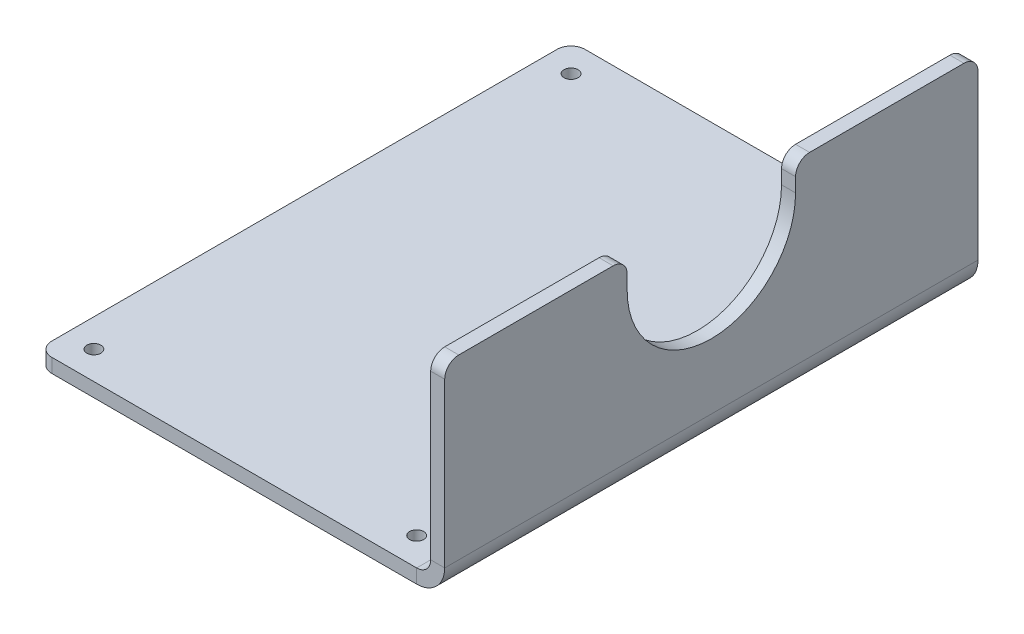
ISO-10303-21;
HEADER;
FILE_DESCRIPTION(('STEP AP214'),'2;1');
FILE_NAME('part.step','',(''),(''),'','','');
FILE_SCHEMA(('AUTOMOTIVE_DESIGN { 1 0 10303 214 1 1 1 1 }'));
ENDSEC;
DATA;
#1=APPLICATION_CONTEXT('core data for automotive mechanical design processes');
#2=APPLICATION_PROTOCOL_DEFINITION('international standard','automotive_design',2000,#1);
#3=PRODUCT_CONTEXT('',#1,'mechanical');
#4=PRODUCT('Part','Part','',(#3));
#5=PRODUCT_RELATED_PRODUCT_CATEGORY('part','',(#4));
#6=PRODUCT_DEFINITION_FORMATION('','',#4);
#7=PRODUCT_DEFINITION_CONTEXT('part definition',#1,'design');
#8=PRODUCT_DEFINITION('design','',#6,#7);
#9=PRODUCT_DEFINITION_SHAPE('','',#8);
#10=(LENGTH_UNIT() NAMED_UNIT(*) SI_UNIT(.MILLI.,.METRE.));
#11=(NAMED_UNIT(*) PLANE_ANGLE_UNIT() SI_UNIT($,.RADIAN.));
#12=(NAMED_UNIT(*) SI_UNIT($,.STERADIAN.) SOLID_ANGLE_UNIT());
#13=UNCERTAINTY_MEASURE_WITH_UNIT(LENGTH_MEASURE(1.E-05),#10,'distance_accuracy_value','');
#14=(GEOMETRIC_REPRESENTATION_CONTEXT(3) GLOBAL_UNCERTAINTY_ASSIGNED_CONTEXT((#13)) GLOBAL_UNIT_ASSIGNED_CONTEXT((#10,
#11,#12)) REPRESENTATION_CONTEXT('',''));
#15=CARTESIAN_POINT('',(0.,0.,0.));
#16=DIRECTION('',(0.,0.,1.));
#17=DIRECTION('',(1.,0.,0.));
#18=AXIS2_PLACEMENT_3D('',#15,#16,#17);
#19=CARTESIAN_POINT('',(88.9000000000003,-86.8559175063607,0.));
#20=DIRECTION('',(1.,0.,0.));
#21=DIRECTION('',(0.,0.,-1.));
#22=AXIS2_PLACEMENT_3D('',#19,#20,#21);
#23=PLANE('',#22);
#24=DIRECTION('',(0.,1.,0.));
#25=VECTOR('',#24,1.);
#26=CARTESIAN_POINT('',(88.9,4.84884832523127E-13,-79.3750000000001));
#27=LINE('',#26,#25);
#28=CARTESIAN_POINT('',(88.8999999999999,40.1440824936393,-79.375));
#29=VERTEX_POINT('',#28);
#30=CARTESIAN_POINT('',(88.8999999999999,43.3190824936393,-79.375));
#31=VERTEX_POINT('',#30);
#32=EDGE_CURVE('E218',#29,#31,#27,.T.);
#33=ORIENTED_EDGE('',*,*,#32,.T.);
#34=CARTESIAN_POINT('',(88.8999999999999,43.3190824936393,-82.55));
#35=DIRECTION('',(1.,0.,0.));
#36=DIRECTION('',(0.,1.,0.));
#37=AXIS2_PLACEMENT_3D('',#34,#35,#36);
#38=CIRCLE('',#37,3.175);
#39=CARTESIAN_POINT('',(88.8999999999999,46.4940824936393,-82.55));
#40=VERTEX_POINT('',#39);
#41=EDGE_CURVE('E307',#31,#40,#38,.F.);
#42=ORIENTED_EDGE('',*,*,#41,.T.);
#43=DIRECTION('',(0.,0.,-1.));
#44=VECTOR('',#43,1.);
#45=CARTESIAN_POINT('',(88.8999999999999,46.4940824936393,0.));
#46=LINE('',#45,#44);
#47=CARTESIAN_POINT('',(88.8999999999999,46.4940824936393,-117.475));
#48=VERTEX_POINT('',#47);
#49=EDGE_CURVE('E274',#40,#48,#46,.T.);
#50=ORIENTED_EDGE('',*,*,#49,.T.);
#51=CARTESIAN_POINT('',(88.8999999999999,43.3190824936393,-117.475));
#52=DIRECTION('',(1.,0.,0.));
#53=DIRECTION('',(0.,1.,0.));
#54=AXIS2_PLACEMENT_3D('',#51,#52,#53);
#55=CIRCLE('',#54,3.175);
#56=CARTESIAN_POINT('',(88.8999999999999,43.3190824936393,-120.65));
#57=VERTEX_POINT('',#56);
#58=EDGE_CURVE('E305',#48,#57,#55,.F.);
#59=ORIENTED_EDGE('',*,*,#58,.T.);
#60=DIRECTION('',(0.,-1.,0.));
#61=VECTOR('',#60,1.);
#62=CARTESIAN_POINT('',(88.9000000000003,-86.8559175063607,-120.65));
#63=LINE('',#62,#61);
#64=CARTESIAN_POINT('',(88.9,6.35000000000001,-120.65));
#65=VERTEX_POINT('',#64);
#66=EDGE_CURVE('E273',#57,#65,#63,.T.);
#67=ORIENTED_EDGE('',*,*,#66,.T.);
#68=DIRECTION('',(0.,0.,1.));
#69=VECTOR('',#68,1.);
#70=CARTESIAN_POINT('',(88.9,6.35000000000001,0.));
#71=LINE('',#70,#69);
#72=CARTESIAN_POINT('',(88.9,6.35000000000001,0.));
#73=VERTEX_POINT('',#72);
#74=EDGE_CURVE('E280',#65,#73,#71,.T.);
#75=ORIENTED_EDGE('',*,*,#74,.T.);
#76=DIRECTION('',(0.,1.,0.));
#77=VECTOR('',#76,1.);
#78=CARTESIAN_POINT('',(88.9000000000003,-86.8559175063607,0.));
#79=LINE('',#78,#77);
#80=CARTESIAN_POINT('',(88.8999999999999,43.3190824936393,0.));
#81=VERTEX_POINT('',#80);
#82=EDGE_CURVE('E295',#73,#81,#79,.T.);
#83=ORIENTED_EDGE('',*,*,#82,.T.);
#84=CARTESIAN_POINT('',(88.8999999999999,43.3190824936393,-3.175));
#85=DIRECTION('',(1.,0.,0.));
#86=DIRECTION('',(0.,1.,0.));
#87=AXIS2_PLACEMENT_3D('',#84,#85,#86);
#88=CIRCLE('',#87,3.175);
#89=CARTESIAN_POINT('',(88.8999999999999,46.4940824936393,-3.175));
#90=VERTEX_POINT('',#89);
#91=EDGE_CURVE('E303',#81,#90,#88,.F.);
#92=ORIENTED_EDGE('',*,*,#91,.T.);
#93=CARTESIAN_POINT('',(88.8999999999999,46.4940824936393,-38.1));
#94=VERTEX_POINT('',#93);
#95=EDGE_CURVE('E270',#90,#94,#46,.T.);
#96=ORIENTED_EDGE('',*,*,#95,.T.);
#97=CARTESIAN_POINT('',(88.8999999999999,43.3190824936393,-38.1));
#98=DIRECTION('',(1.,0.,0.));
#99=DIRECTION('',(0.,1.,0.));
#100=AXIS2_PLACEMENT_3D('',#97,#98,#99);
#101=CIRCLE('',#100,3.175);
#102=CARTESIAN_POINT('',(88.8999999999999,43.3190824936393,-41.275));
#103=VERTEX_POINT('',#102);
#104=EDGE_CURVE('E301',#94,#103,#101,.F.);
#105=ORIENTED_EDGE('',*,*,#104,.T.);
#106=DIRECTION('',(0.,-1.,0.));
#107=VECTOR('',#106,1.);
#108=CARTESIAN_POINT('',(88.9,3.56515295300843E-13,-41.275));
#109=LINE('',#108,#107);
#110=CARTESIAN_POINT('',(88.8999999999999,40.1440824936393,-41.275));
#111=VERTEX_POINT('',#110);
#112=EDGE_CURVE('E221',#103,#111,#109,.T.);
#113=ORIENTED_EDGE('',*,*,#112,.T.);
#114=CARTESIAN_POINT('',(88.8999999999999,40.1440824936393,-60.325));
#115=DIRECTION('',(-1.,0.,0.));
#116=DIRECTION('',(0.,-1.,0.));
#117=AXIS2_PLACEMENT_3D('',#114,#115,#116);
#118=CIRCLE('',#117,19.05);
#119=EDGE_CURVE('E211',#111,#29,#118,.F.);
#120=ORIENTED_EDGE('',*,*,#119,.T.);
#121=EDGE_LOOP('',(#33,#42,#50,#59,#67,#75,#83,#92,#96,#105,#113,#120));
#122=FACE_BOUND('',#121,.T.);
#123=ADVANCED_FACE('F64',(#122),#23,.F.);
#124=CARTESIAN_POINT('',(88.8999999999999,46.4940824936393,0.));
#125=DIRECTION('',(0.,-1.,0.));
#126=DIRECTION('',(0.,0.,-1.));
#127=AXIS2_PLACEMENT_3D('',#124,#125,#126);
#128=PLANE('',#127);
#129=ORIENTED_EDGE('',*,*,#49,.F.);
#130=DIRECTION('',(-1.,0.,0.));
#131=VECTOR('',#130,1.);
#132=CARTESIAN_POINT('',(88.8999999999999,46.4940824936393,-82.55));
#133=LINE('',#132,#131);
#134=CARTESIAN_POINT('',(92.0749999999999,46.4940824936393,-82.55));
#135=VERTEX_POINT('',#134);
#136=EDGE_CURVE('E312',#40,#135,#133,.F.);
#137=ORIENTED_EDGE('',*,*,#136,.T.);
#138=DIRECTION('',(0.,0.,-1.));
#139=VECTOR('',#138,1.);
#140=CARTESIAN_POINT('',(92.0749999999999,46.4940824936393,0.));
#141=LINE('',#140,#139);
#142=CARTESIAN_POINT('',(92.0749999999999,46.4940824936393,-117.475));
#143=VERTEX_POINT('',#142);
#144=EDGE_CURVE('E279',#135,#143,#141,.T.);
#145=ORIENTED_EDGE('',*,*,#144,.T.);
#146=DIRECTION('',(1.,0.,0.));
#147=VECTOR('',#146,1.);
#148=CARTESIAN_POINT('',(88.8999999999999,46.4940824936393,-117.475));
#149=LINE('',#148,#147);
#150=EDGE_CURVE('E309',#143,#48,#149,.F.);
#151=ORIENTED_EDGE('',*,*,#150,.T.);
#152=EDGE_LOOP('',(#129,#137,#145,#151));
#153=FACE_BOUND('',#152,.T.);
#154=ADVANCED_FACE('F385',(#153),#128,.F.);
#155=ORIENTED_EDGE('',*,*,#95,.F.);
#156=DIRECTION('',(1.,0.,0.));
#157=VECTOR('',#156,1.);
#158=CARTESIAN_POINT('',(88.8999999999999,46.4940824936393,-3.175));
#159=LINE('',#158,#157);
#160=CARTESIAN_POINT('',(92.0749999999999,46.4940824936393,-3.175));
#161=VERTEX_POINT('',#160);
#162=EDGE_CURVE('E330',#90,#161,#159,.T.);
#163=ORIENTED_EDGE('',*,*,#162,.T.);
#164=CARTESIAN_POINT('',(92.0749999999999,46.4940824936393,-38.1));
#165=VERTEX_POINT('',#164);
#166=EDGE_CURVE('E275',#161,#165,#141,.T.);
#167=ORIENTED_EDGE('',*,*,#166,.T.);
#168=DIRECTION('',(-1.,0.,0.));
#169=VECTOR('',#168,1.);
#170=CARTESIAN_POINT('',(88.8999999999999,46.4940824936393,-38.1));
#171=LINE('',#170,#169);
#172=EDGE_CURVE('E327',#165,#94,#171,.T.);
#173=ORIENTED_EDGE('',*,*,#172,.T.);
#174=EDGE_LOOP('',(#155,#163,#167,#173));
#175=FACE_BOUND('',#174,.T.);
#176=ADVANCED_FACE('F392',(#175),#128,.F.);
#177=CARTESIAN_POINT('',(92.0750000000003,-86.8559175063607,0.));
#178=DIRECTION('',(1.,0.,0.));
#179=DIRECTION('',(0.,0.,-1.));
#180=AXIS2_PLACEMENT_3D('',#177,#178,#179);
#181=PLANE('',#180);
#182=ORIENTED_EDGE('',*,*,#144,.F.);
#183=CARTESIAN_POINT('',(92.0749999999999,43.3190824936393,-82.55));
#184=DIRECTION('',(1.,0.,0.));
#185=DIRECTION('',(0.,1.,0.));
#186=AXIS2_PLACEMENT_3D('',#183,#184,#185);
#187=CIRCLE('',#186,3.175);
#188=CARTESIAN_POINT('',(92.075,43.3190824936393,-79.375));
#189=VERTEX_POINT('',#188);
#190=EDGE_CURVE('E320',#135,#189,#187,.T.);
#191=ORIENTED_EDGE('',*,*,#190,.T.);
#192=DIRECTION('',(0.,1.,0.));
#193=VECTOR('',#192,1.);
#194=CARTESIAN_POINT('',(92.0750000000002,4.95970285773954E-13,-79.3750000000001));
#195=LINE('',#194,#193);
#196=CARTESIAN_POINT('',(92.075,40.1440824936393,-79.375));
#197=VERTEX_POINT('',#196);
#198=EDGE_CURVE('E203',#197,#189,#195,.T.);
#199=ORIENTED_EDGE('',*,*,#198,.F.);
#200=CARTESIAN_POINT('',(92.075,40.1440824936393,-60.325));
#201=DIRECTION('',(-1.,0.,0.));
#202=DIRECTION('',(0.,-1.,0.));
#203=AXIS2_PLACEMENT_3D('',#200,#201,#202);
#204=CIRCLE('',#203,19.05);
#205=CARTESIAN_POINT('',(92.075,40.1440824936393,-41.275));
#206=VERTEX_POINT('',#205);
#207=EDGE_CURVE('E204',#206,#197,#204,.F.);
#208=ORIENTED_EDGE('',*,*,#207,.F.);
#209=DIRECTION('',(0.,-1.,0.));
#210=VECTOR('',#209,1.);
#211=CARTESIAN_POINT('',(92.0750000000002,3.6760074855167E-13,-41.275));
#212=LINE('',#211,#210);
#213=CARTESIAN_POINT('',(92.075,43.3190824936393,-41.275));
#214=VERTEX_POINT('',#213);
#215=EDGE_CURVE('E192',#214,#206,#212,.T.);
#216=ORIENTED_EDGE('',*,*,#215,.F.);
#217=CARTESIAN_POINT('',(92.0749999999999,43.3190824936393,-38.1));
#218=DIRECTION('',(1.,0.,0.));
#219=DIRECTION('',(0.,1.,0.));
#220=AXIS2_PLACEMENT_3D('',#217,#218,#219);
#221=CIRCLE('',#220,3.175);
#222=EDGE_CURVE('E314',#214,#165,#221,.T.);
#223=ORIENTED_EDGE('',*,*,#222,.T.);
#224=ORIENTED_EDGE('',*,*,#166,.F.);
#225=CARTESIAN_POINT('',(92.0749999999999,43.3190824936393,-3.175));
#226=DIRECTION('',(1.,0.,0.));
#227=DIRECTION('',(0.,1.,0.));
#228=AXIS2_PLACEMENT_3D('',#225,#226,#227);
#229=CIRCLE('',#228,3.175);
#230=CARTESIAN_POINT('',(92.0749999999999,43.3190824936393,0.));
#231=VERTEX_POINT('',#230);
#232=EDGE_CURVE('E316',#161,#231,#229,.T.);
#233=ORIENTED_EDGE('',*,*,#232,.T.);
#234=DIRECTION('',(0.,1.,0.));
#235=VECTOR('',#234,1.);
#236=CARTESIAN_POINT('',(92.0750000000003,-86.8559175063607,0.));
#237=LINE('',#236,#235);
#238=CARTESIAN_POINT('',(92.075,6.35000000000002,0.));
#239=VERTEX_POINT('',#238);
#240=EDGE_CURVE('E246',#239,#231,#237,.T.);
#241=ORIENTED_EDGE('',*,*,#240,.F.);
#242=DIRECTION('',(0.,0.,1.));
#243=VECTOR('',#242,1.);
#244=CARTESIAN_POINT('',(92.075,6.35000000000002,0.));
#245=LINE('',#244,#243);
#246=CARTESIAN_POINT('',(92.075,6.35000000000002,-120.65));
#247=VERTEX_POINT('',#246);
#248=EDGE_CURVE('E286',#247,#239,#245,.T.);
#249=ORIENTED_EDGE('',*,*,#248,.F.);
#250=DIRECTION('',(0.,1.,0.));
#251=VECTOR('',#250,1.);
#252=CARTESIAN_POINT('',(92.0750000000003,-86.8559175063607,-120.65));
#253=LINE('',#252,#251);
#254=CARTESIAN_POINT('',(92.0749999999999,43.3190824936393,-120.65));
#255=VERTEX_POINT('',#254);
#256=EDGE_CURVE('E278',#255,#247,#253,.F.);
#257=ORIENTED_EDGE('',*,*,#256,.F.);
#258=CARTESIAN_POINT('',(92.0749999999999,43.3190824936393,-117.475));
#259=DIRECTION('',(1.,0.,0.));
#260=DIRECTION('',(0.,1.,0.));
#261=AXIS2_PLACEMENT_3D('',#258,#259,#260);
#262=CIRCLE('',#261,3.175);
#263=EDGE_CURVE('E318',#255,#143,#262,.T.);
#264=ORIENTED_EDGE('',*,*,#263,.T.);
#265=EDGE_LOOP('',(#182,#191,#199,#208,#216,#223,#224,#233,#241,#249,#257,#264));
#266=FACE_BOUND('',#265,.T.);
#267=ADVANCED_FACE('F216',(#266),#181,.T.);
#268=CARTESIAN_POINT('',(88.9000000000003,-86.8559175063607,-120.65));
#269=DIRECTION('',(0.,0.,1.));
#270=DIRECTION('',(0.,-1.,0.));
#271=AXIS2_PLACEMENT_3D('',#268,#269,#270);
#272=PLANE('',#271);
#273=ORIENTED_EDGE('',*,*,#66,.F.);
#274=DIRECTION('',(1.,0.,0.));
#275=VECTOR('',#274,1.);
#276=CARTESIAN_POINT('',(88.8999999999999,43.3190824936393,-120.65));
#277=LINE('',#276,#275);
#278=EDGE_CURVE('E322',#57,#255,#277,.T.);
#279=ORIENTED_EDGE('',*,*,#278,.T.);
#280=ORIENTED_EDGE('',*,*,#256,.T.);
#281=DIRECTION('',(1.,0.,0.));
#282=VECTOR('',#281,1.);
#283=CARTESIAN_POINT('',(88.9,6.35000000000001,-120.65));
#284=LINE('',#283,#282);
#285=EDGE_CURVE('E283',#65,#247,#284,.T.);
#286=ORIENTED_EDGE('',*,*,#285,.F.);
#287=EDGE_LOOP('',(#273,#279,#280,#286));
#288=FACE_BOUND('',#287,.T.);
#289=ADVANCED_FACE('F397',(#288),#272,.F.);
#290=CARTESIAN_POINT('',(88.9000000000003,-86.8559175063607,0.));
#291=DIRECTION('',(0.,0.,-1.));
#292=DIRECTION('',(0.,1.,0.));
#293=AXIS2_PLACEMENT_3D('',#290,#291,#292);
#294=PLANE('',#293);
#295=ORIENTED_EDGE('',*,*,#240,.T.);
#296=DIRECTION('',(1.,0.,0.));
#297=VECTOR('',#296,1.);
#298=CARTESIAN_POINT('',(88.8999999999999,43.3190824936393,0.));
#299=LINE('',#298,#297);
#300=EDGE_CURVE('E324',#231,#81,#299,.F.);
#301=ORIENTED_EDGE('',*,*,#300,.T.);
#302=ORIENTED_EDGE('',*,*,#82,.F.);
#303=DIRECTION('',(-1.,0.,0.));
#304=VECTOR('',#303,1.);
#305=CARTESIAN_POINT('',(88.9,6.35000000000001,0.));
#306=LINE('',#305,#304);
#307=EDGE_CURVE('E288',#239,#73,#306,.T.);
#308=ORIENTED_EDGE('',*,*,#307,.F.);
#309=EDGE_LOOP('',(#295,#301,#302,#308));
#310=FACE_BOUND('',#309,.T.);
#311=ADVANCED_FACE('F400',(#310),#294,.F.);
#312=CARTESIAN_POINT('',(0.,3.175,0.));
#313=DIRECTION('',(1.,0.,0.));
#314=DIRECTION('',(0.,0.,1.));
#315=AXIS2_PLACEMENT_3D('',#312,#313,#314);
#316=PLANE('',#315);
#317=DIRECTION('',(0.,0.,-1.));
#318=VECTOR('',#317,1.);
#319=CARTESIAN_POINT('',(0.,0.,0.));
#320=LINE('',#319,#318);
#321=CARTESIAN_POINT('',(0.,0.,-117.475));
#322=VERTEX_POINT('',#321);
#323=CARTESIAN_POINT('',(0.,0.,-3.175));
#324=VERTEX_POINT('',#323);
#325=EDGE_CURVE('E265',#322,#324,#320,.F.);
#326=ORIENTED_EDGE('',*,*,#325,.T.);
#327=DIRECTION('',(0.,-1.,0.));
#328=VECTOR('',#327,1.);
#329=CARTESIAN_POINT('',(0.,3.175,-3.175));
#330=LINE('',#329,#328);
#331=CARTESIAN_POINT('',(0.,3.175,-3.175));
#332=VERTEX_POINT('',#331);
#333=EDGE_CURVE('E335',#324,#332,#330,.F.);
#334=ORIENTED_EDGE('',*,*,#333,.T.);
#335=DIRECTION('',(0.,0.,1.));
#336=VECTOR('',#335,1.);
#337=CARTESIAN_POINT('',(0.,3.175,0.));
#338=LINE('',#337,#336);
#339=CARTESIAN_POINT('',(0.,3.175,-117.475));
#340=VERTEX_POINT('',#339);
#341=EDGE_CURVE('E259',#340,#332,#338,.T.);
#342=ORIENTED_EDGE('',*,*,#341,.F.);
#343=DIRECTION('',(0.,-1.,0.));
#344=VECTOR('',#343,1.);
#345=CARTESIAN_POINT('',(0.,3.175,-117.475));
#346=LINE('',#345,#344);
#347=EDGE_CURVE('E333',#340,#322,#346,.T.);
#348=ORIENTED_EDGE('',*,*,#347,.T.);
#349=EDGE_LOOP('',(#326,#334,#342,#348));
#350=FACE_BOUND('',#349,.T.);
#351=ADVANCED_FACE('F348',(#350),#316,.F.);
#352=CARTESIAN_POINT('',(0.,3.175,0.));
#353=DIRECTION('',(0.,-1.,0.));
#354=DIRECTION('',(0.,0.,-1.));
#355=AXIS2_PLACEMENT_3D('',#352,#353,#354);
#356=PLANE('',#355);
#357=CARTESIAN_POINT('',(79.375,3.175,-6.34999999999999));
#358=DIRECTION('',(0.,1.,0.));
#359=DIRECTION('',(0.,0.,1.));
#360=AXIS2_PLACEMENT_3D('',#357,#358,#359);
#361=CIRCLE('',#360,1.5875);
#362=CARTESIAN_POINT('',(79.375,3.175,-4.76249999999999));
#363=VERTEX_POINT('',#362);
#364=EDGE_CURVE('E719',#363,#363,#361,.T.);
#365=ORIENTED_EDGE('',*,*,#364,.F.);
#366=EDGE_LOOP('',(#365));
#367=FACE_BOUND('',#366,.T.);
#368=CARTESIAN_POINT('',(6.35000000000001,3.175,-6.34999999999999));
#369=DIRECTION('',(0.,1.,0.));
#370=DIRECTION('',(0.,0.,1.));
#371=AXIS2_PLACEMENT_3D('',#368,#369,#370);
#372=CIRCLE('',#371,1.5875);
#373=CARTESIAN_POINT('',(6.35000000000001,3.175,-4.76249999999999));
#374=VERTEX_POINT('',#373);
#375=EDGE_CURVE('E721',#374,#374,#372,.T.);
#376=ORIENTED_EDGE('',*,*,#375,.F.);
#377=EDGE_LOOP('',(#376));
#378=FACE_BOUND('',#377,.T.);
#379=CARTESIAN_POINT('',(79.375,3.175,-114.3));
#380=DIRECTION('',(0.,1.,0.));
#381=DIRECTION('',(0.,0.,1.));
#382=AXIS2_PLACEMENT_3D('',#379,#380,#381);
#383=CIRCLE('',#382,1.5875);
#384=CARTESIAN_POINT('',(79.375,3.175,-112.7125));
#385=VERTEX_POINT('',#384);
#386=EDGE_CURVE('E727',#385,#385,#383,.T.);
#387=ORIENTED_EDGE('',*,*,#386,.F.);
#388=EDGE_LOOP('',(#387));
#389=FACE_BOUND('',#388,.T.);
#390=CARTESIAN_POINT('',(6.35,3.175,-114.3));
#391=DIRECTION('',(0.,1.,0.));
#392=DIRECTION('',(0.,0.,1.));
#393=AXIS2_PLACEMENT_3D('',#390,#391,#392);
#394=CIRCLE('',#393,1.5875);
#395=CARTESIAN_POINT('',(6.35,3.175,-112.7125));
#396=VERTEX_POINT('',#395);
#397=EDGE_CURVE('E224',#396,#396,#394,.T.);
#398=ORIENTED_EDGE('',*,*,#397,.F.);
#399=EDGE_LOOP('',(#398));
#400=FACE_BOUND('',#399,.T.);
#401=ORIENTED_EDGE('',*,*,#341,.T.);
#402=CARTESIAN_POINT('',(3.175,3.175,-3.175));
#403=DIRECTION('',(0.,-1.,0.));
#404=DIRECTION('',(0.,0.,-1.));
#405=AXIS2_PLACEMENT_3D('',#402,#403,#404);
#406=CIRCLE('',#405,3.175);
#407=CARTESIAN_POINT('',(3.175,3.175,0.));
#408=VERTEX_POINT('',#407);
#409=EDGE_CURVE('E340',#332,#408,#406,.F.);
#410=ORIENTED_EDGE('',*,*,#409,.T.);
#411=DIRECTION('',(1.,0.,0.));
#412=VECTOR('',#411,1.);
#413=CARTESIAN_POINT('',(0.,3.175,0.));
#414=LINE('',#413,#412);
#415=CARTESIAN_POINT('',(85.725,3.175,0.));
#416=VERTEX_POINT('',#415);
#417=EDGE_CURVE('E257',#408,#416,#414,.T.);
#418=ORIENTED_EDGE('',*,*,#417,.T.);
#419=DIRECTION('',(0.,0.,1.));
#420=VECTOR('',#419,1.);
#421=CARTESIAN_POINT('',(85.725,3.175,0.));
#422=LINE('',#421,#420);
#423=CARTESIAN_POINT('',(85.725,3.175,-120.65));
#424=VERTEX_POINT('',#423);
#425=EDGE_CURVE('E239',#424,#416,#422,.T.);
#426=ORIENTED_EDGE('',*,*,#425,.F.);
#427=DIRECTION('',(-1.,0.,0.));
#428=VECTOR('',#427,1.);
#429=CARTESIAN_POINT('',(0.,3.175,-120.65));
#430=LINE('',#429,#428);
#431=CARTESIAN_POINT('',(3.175,3.175,-120.65));
#432=VERTEX_POINT('',#431);
#433=EDGE_CURVE('E262',#424,#432,#430,.T.);
#434=ORIENTED_EDGE('',*,*,#433,.T.);
#435=CARTESIAN_POINT('',(3.175,3.175,-117.475));
#436=DIRECTION('',(0.,-1.,0.));
#437=DIRECTION('',(0.,0.,-1.));
#438=AXIS2_PLACEMENT_3D('',#435,#436,#437);
#439=CIRCLE('',#438,3.175);
#440=EDGE_CURVE('E338',#432,#340,#439,.F.);
#441=ORIENTED_EDGE('',*,*,#440,.T.);
#442=EDGE_LOOP('',(#401,#410,#418,#426,#434,#441));
#443=FACE_BOUND('',#442,.T.);
#444=ADVANCED_FACE('F353',(#367,#378,#389,#400,#443),#356,.F.);
#445=CARTESIAN_POINT('',(0.,3.175,-120.65));
#446=DIRECTION('',(0.,0.,1.));
#447=DIRECTION('',(-1.,0.,0.));
#448=AXIS2_PLACEMENT_3D('',#445,#446,#447);
#449=PLANE('',#448);
#450=DIRECTION('',(1.,0.,0.));
#451=VECTOR('',#450,1.);
#452=CARTESIAN_POINT('',(0.,0.,-120.65));
#453=LINE('',#452,#451);
#454=CARTESIAN_POINT('',(85.725,0.,-120.65));
#455=VERTEX_POINT('',#454);
#456=CARTESIAN_POINT('',(3.175,0.,-120.65));
#457=VERTEX_POINT('',#456);
#458=EDGE_CURVE('E252',#455,#457,#453,.F.);
#459=ORIENTED_EDGE('',*,*,#458,.T.);
#460=DIRECTION('',(0.,-1.,0.));
#461=VECTOR('',#460,1.);
#462=CARTESIAN_POINT('',(3.175,3.175,-120.65));
#463=LINE('',#462,#461);
#464=EDGE_CURVE('E12',#457,#432,#463,.F.);
#465=ORIENTED_EDGE('',*,*,#464,.T.);
#466=ORIENTED_EDGE('',*,*,#433,.F.);
#467=DIRECTION('',(0.,-1.,0.));
#468=VECTOR('',#467,1.);
#469=CARTESIAN_POINT('',(85.725,3.175,-120.65));
#470=LINE('',#469,#468);
#471=EDGE_CURVE('E254',#424,#455,#470,.T.);
#472=ORIENTED_EDGE('',*,*,#471,.T.);
#473=EDGE_LOOP('',(#459,#465,#466,#472));
#474=FACE_BOUND('',#473,.T.);
#475=ADVANCED_FACE('F370',(#474),#449,.F.);
#476=CARTESIAN_POINT('',(0.,0.,0.));
#477=DIRECTION('',(0.,-1.,0.));
#478=DIRECTION('',(0.,0.,-1.));
#479=AXIS2_PLACEMENT_3D('',#476,#477,#478);
#480=PLANE('',#479);
#481=CARTESIAN_POINT('',(79.375,0.,-6.34999999999999));
#482=DIRECTION('',(0.,1.,0.));
#483=DIRECTION('',(0.,0.,1.));
#484=AXIS2_PLACEMENT_3D('',#481,#482,#483);
#485=CIRCLE('',#484,1.5875);
#486=CARTESIAN_POINT('',(79.375,0.,-4.76249999999999));
#487=VERTEX_POINT('',#486);
#488=EDGE_CURVE('E716',#487,#487,#485,.T.);
#489=ORIENTED_EDGE('',*,*,#488,.T.);
#490=EDGE_LOOP('',(#489));
#491=FACE_BOUND('',#490,.T.);
#492=CARTESIAN_POINT('',(6.35000000000001,0.,-6.34999999999999));
#493=DIRECTION('',(0.,1.,0.));
#494=DIRECTION('',(0.,0.,1.));
#495=AXIS2_PLACEMENT_3D('',#492,#493,#494);
#496=CIRCLE('',#495,1.5875);
#497=CARTESIAN_POINT('',(6.35000000000001,0.,-4.76249999999999));
#498=VERTEX_POINT('',#497);
#499=EDGE_CURVE('E724',#498,#498,#496,.T.);
#500=ORIENTED_EDGE('',*,*,#499,.T.);
#501=EDGE_LOOP('',(#500));
#502=FACE_BOUND('',#501,.T.);
#503=CARTESIAN_POINT('',(79.375,0.,-114.3));
#504=DIRECTION('',(0.,1.,0.));
#505=DIRECTION('',(0.,0.,1.));
#506=AXIS2_PLACEMENT_3D('',#503,#504,#505);
#507=CIRCLE('',#506,1.5875);
#508=CARTESIAN_POINT('',(79.375,0.,-112.7125));
#509=VERTEX_POINT('',#508);
#510=EDGE_CURVE('E730',#509,#509,#507,.T.);
#511=ORIENTED_EDGE('',*,*,#510,.T.);
#512=EDGE_LOOP('',(#511));
#513=FACE_BOUND('',#512,.T.);
#514=CARTESIAN_POINT('',(6.35,0.,-114.3));
#515=DIRECTION('',(0.,1.,0.));
#516=DIRECTION('',(0.,0.,1.));
#517=AXIS2_PLACEMENT_3D('',#514,#515,#516);
#518=CIRCLE('',#517,1.5875);
#519=CARTESIAN_POINT('',(6.35,0.,-112.7125));
#520=VERTEX_POINT('',#519);
#521=EDGE_CURVE('E229',#520,#520,#518,.T.);
#522=ORIENTED_EDGE('',*,*,#521,.T.);
#523=EDGE_LOOP('',(#522));
#524=FACE_BOUND('',#523,.T.);
#525=DIRECTION('',(1.,0.,0.));
#526=VECTOR('',#525,1.);
#527=CARTESIAN_POINT('',(0.,0.,0.));
#528=LINE('',#527,#526);
#529=CARTESIAN_POINT('',(3.175,0.,0.));
#530=VERTEX_POINT('',#529);
#531=CARTESIAN_POINT('',(85.725,0.,0.));
#532=VERTEX_POINT('',#531);
#533=EDGE_CURVE('E247',#530,#532,#528,.T.);
#534=ORIENTED_EDGE('',*,*,#533,.F.);
#535=CARTESIAN_POINT('',(3.175,0.,-3.175));
#536=DIRECTION('',(0.,-1.,0.));
#537=DIRECTION('',(0.,0.,-1.));
#538=AXIS2_PLACEMENT_3D('',#535,#536,#537);
#539=CIRCLE('',#538,3.175);
#540=EDGE_CURVE('E72',#530,#324,#539,.T.);
#541=ORIENTED_EDGE('',*,*,#540,.T.);
#542=ORIENTED_EDGE('',*,*,#325,.F.);
#543=CARTESIAN_POINT('',(3.175,0.,-117.475));
#544=DIRECTION('',(0.,-1.,0.));
#545=DIRECTION('',(0.,0.,-1.));
#546=AXIS2_PLACEMENT_3D('',#543,#544,#545);
#547=CIRCLE('',#546,3.175);
#548=EDGE_CURVE('E79',#322,#457,#547,.T.);
#549=ORIENTED_EDGE('',*,*,#548,.T.);
#550=ORIENTED_EDGE('',*,*,#458,.F.);
#551=DIRECTION('',(0.,0.,1.));
#552=VECTOR('',#551,1.);
#553=CARTESIAN_POINT('',(85.725,0.,0.));
#554=LINE('',#553,#552);
#555=EDGE_CURVE('E249',#455,#532,#554,.T.);
#556=ORIENTED_EDGE('',*,*,#555,.T.);
#557=EDGE_LOOP('',(#534,#541,#542,#549,#550,#556));
#558=FACE_BOUND('',#557,.T.);
#559=ADVANCED_FACE('F344',(#491,#502,#513,#524,#558),#480,.T.);
#560=CARTESIAN_POINT('',(0.,3.175,0.));
#561=DIRECTION('',(0.,0.,-1.));
#562=DIRECTION('',(1.,0.,0.));
#563=AXIS2_PLACEMENT_3D('',#560,#561,#562);
#564=PLANE('',#563);
#565=ORIENTED_EDGE('',*,*,#417,.F.);
#566=DIRECTION('',(0.,-1.,0.));
#567=VECTOR('',#566,1.);
#568=CARTESIAN_POINT('',(3.175,3.175,0.));
#569=LINE('',#568,#567);
#570=EDGE_CURVE('E87',#408,#530,#569,.T.);
#571=ORIENTED_EDGE('',*,*,#570,.T.);
#572=ORIENTED_EDGE('',*,*,#533,.T.);
#573=DIRECTION('',(0.,1.,0.));
#574=VECTOR('',#573,1.);
#575=CARTESIAN_POINT('',(85.725,3.175,0.));
#576=LINE('',#575,#574);
#577=EDGE_CURVE('E243',#532,#416,#576,.T.);
#578=ORIENTED_EDGE('',*,*,#577,.T.);
#579=EDGE_LOOP('',(#565,#571,#572,#578));
#580=FACE_BOUND('',#579,.T.);
#581=ADVANCED_FACE('F355',(#580),#564,.F.);
#582=CARTESIAN_POINT('',(85.725,6.35,-120.65));
#583=DIRECTION('',(0.,0.,1.));
#584=DIRECTION('',(1.,0.,0.));
#585=AXIS2_PLACEMENT_3D('',#582,#583,#584);
#586=PLANE('',#585);
#587=ORIENTED_EDGE('',*,*,#285,.T.);
#588=CARTESIAN_POINT('',(85.725,6.35,-120.65));
#589=DIRECTION('',(0.,0.,-1.));
#590=DIRECTION('',(-1.,0.,0.));
#591=AXIS2_PLACEMENT_3D('',#588,#589,#590);
#592=CIRCLE('',#591,6.35);
#593=EDGE_CURVE('E231',#247,#455,#592,.T.);
#594=ORIENTED_EDGE('',*,*,#593,.T.);
#595=ORIENTED_EDGE('',*,*,#471,.F.);
#596=CARTESIAN_POINT('',(85.725,6.35,-120.65));
#597=DIRECTION('',(0.,0.,-1.));
#598=DIRECTION('',(-1.,0.,0.));
#599=AXIS2_PLACEMENT_3D('',#596,#597,#598);
#600=CIRCLE('',#599,3.175);
#601=EDGE_CURVE('E233',#65,#424,#600,.T.);
#602=ORIENTED_EDGE('',*,*,#601,.F.);
#603=EDGE_LOOP('',(#587,#594,#595,#602));
#604=FACE_BOUND('',#603,.T.);
#605=ADVANCED_FACE('F373',(#604),#586,.F.);
#606=CARTESIAN_POINT('',(85.725,6.35,0.));
#607=DIRECTION('',(0.,0.,-1.));
#608=DIRECTION('',(-1.,0.,0.));
#609=AXIS2_PLACEMENT_3D('',#606,#607,#608);
#610=PLANE('',#609);
#611=CARTESIAN_POINT('',(85.725,6.35,0.));
#612=DIRECTION('',(0.,0.,-1.));
#613=DIRECTION('',(-1.,0.,0.));
#614=AXIS2_PLACEMENT_3D('',#611,#612,#613);
#615=CIRCLE('',#614,6.35);
#616=EDGE_CURVE('E237',#532,#239,#615,.F.);
#617=ORIENTED_EDGE('',*,*,#616,.T.);
#618=ORIENTED_EDGE('',*,*,#307,.T.);
#619=CARTESIAN_POINT('',(85.725,6.35,0.));
#620=DIRECTION('',(0.,0.,1.));
#621=DIRECTION('',(1.,0.,0.));
#622=AXIS2_PLACEMENT_3D('',#619,#620,#621);
#623=CIRCLE('',#622,3.175);
#624=EDGE_CURVE('E236',#416,#73,#623,.T.);
#625=ORIENTED_EDGE('',*,*,#624,.F.);
#626=ORIENTED_EDGE('',*,*,#577,.F.);
#627=EDGE_LOOP('',(#617,#618,#625,#626));
#628=FACE_BOUND('',#627,.T.);
#629=ADVANCED_FACE('F360',(#628),#610,.F.);
#630=CARTESIAN_POINT('',(85.725,6.35,60.5983941457854));
#631=DIRECTION('',(0.,0.,-1.));
#632=DIRECTION('',(-1.,0.,0.));
#633=AXIS2_PLACEMENT_3D('',#630,#631,#632);
#634=CYLINDRICAL_SURFACE('',#633,3.175);
#635=ORIENTED_EDGE('',*,*,#425,.T.);
#636=ORIENTED_EDGE('',*,*,#624,.T.);
#637=ORIENTED_EDGE('',*,*,#74,.F.);
#638=ORIENTED_EDGE('',*,*,#601,.T.);
#639=EDGE_LOOP('',(#635,#636,#637,#638));
#640=FACE_BOUND('',#639,.T.);
#641=ADVANCED_FACE('F377',(#640),#634,.F.);
#642=CARTESIAN_POINT('',(85.725,6.35,60.5983941457854));
#643=DIRECTION('',(0.,0.,-1.));
#644=DIRECTION('',(-1.,0.,0.));
#645=AXIS2_PLACEMENT_3D('',#642,#643,#644);
#646=CYLINDRICAL_SURFACE('',#645,6.35);
#647=ORIENTED_EDGE('',*,*,#555,.F.);
#648=ORIENTED_EDGE('',*,*,#593,.F.);
#649=ORIENTED_EDGE('',*,*,#248,.T.);
#650=ORIENTED_EDGE('',*,*,#616,.F.);
#651=EDGE_LOOP('',(#647,#648,#649,#650));
#652=FACE_BOUND('',#651,.T.);
#653=ADVANCED_FACE('F364',(#652),#646,.T.);
#654=CARTESIAN_POINT('',(92.075,40.1440824936393,-60.325));
#655=DIRECTION('',(-1.,0.,0.));
#656=DIRECTION('',(0.,-1.,0.));
#657=AXIS2_PLACEMENT_3D('',#654,#655,#656);
#658=CYLINDRICAL_SURFACE('',#657,19.05);
#659=ORIENTED_EDGE('',*,*,#119,.F.);
#660=DIRECTION('',(-1.,0.,0.));
#661=VECTOR('',#660,1.);
#662=CARTESIAN_POINT('',(92.075,40.1440824936393,-41.275));
#663=LINE('',#662,#661);
#664=EDGE_CURVE('E196',#206,#111,#663,.T.);
#665=ORIENTED_EDGE('',*,*,#664,.F.);
#666=ORIENTED_EDGE('',*,*,#207,.T.);
#667=DIRECTION('',(-1.,0.,0.));
#668=VECTOR('',#667,1.);
#669=CARTESIAN_POINT('',(92.075,40.1440824936393,-79.375));
#670=LINE('',#669,#668);
#671=EDGE_CURVE('E212',#197,#29,#670,.T.);
#672=ORIENTED_EDGE('',*,*,#671,.T.);
#673=EDGE_LOOP('',(#659,#665,#666,#672));
#674=FACE_BOUND('',#673,.T.);
#675=ADVANCED_FACE('F207',(#674),#658,.F.);
#676=CARTESIAN_POINT('',(92.0750000000002,4.95970285773954E-13,-79.3750000000001));
#677=DIRECTION('',(0.,0.,1.));
#678=DIRECTION('',(0.,-1.,0.));
#679=AXIS2_PLACEMENT_3D('',#676,#677,#678);
#680=PLANE('',#679);
#681=ORIENTED_EDGE('',*,*,#198,.T.);
#682=DIRECTION('',(1.,0.,0.));
#683=VECTOR('',#682,1.);
#684=CARTESIAN_POINT('',(92.075,43.3190824936393,-79.375));
#685=LINE('',#684,#683);
#686=EDGE_CURVE('E291',#189,#31,#685,.F.);
#687=ORIENTED_EDGE('',*,*,#686,.T.);
#688=ORIENTED_EDGE('',*,*,#32,.F.);
#689=ORIENTED_EDGE('',*,*,#671,.F.);
#690=EDGE_LOOP('',(#681,#687,#688,#689));
#691=FACE_BOUND('',#690,.T.);
#692=ADVANCED_FACE('F445',(#691),#680,.T.);
#693=CARTESIAN_POINT('',(92.0750000000002,3.6760074855167E-13,-41.275));
#694=DIRECTION('',(0.,0.,-1.));
#695=DIRECTION('',(0.,1.,0.));
#696=AXIS2_PLACEMENT_3D('',#693,#694,#695);
#697=PLANE('',#696);
#698=ORIENTED_EDGE('',*,*,#112,.F.);
#699=DIRECTION('',(1.,0.,0.));
#700=VECTOR('',#699,1.);
#701=CARTESIAN_POINT('',(92.075,43.3190824936393,-41.275));
#702=LINE('',#701,#700);
#703=EDGE_CURVE('E199',#103,#214,#702,.T.);
#704=ORIENTED_EDGE('',*,*,#703,.T.);
#705=ORIENTED_EDGE('',*,*,#215,.T.);
#706=ORIENTED_EDGE('',*,*,#664,.T.);
#707=EDGE_LOOP('',(#698,#704,#705,#706));
#708=FACE_BOUND('',#707,.T.);
#709=ADVANCED_FACE('F195',(#708),#697,.T.);
#710=CARTESIAN_POINT('',(6.35,0.,-114.3));
#711=DIRECTION('',(0.,1.,0.));
#712=DIRECTION('',(0.,0.,1.));
#713=AXIS2_PLACEMENT_3D('',#710,#711,#712);
#714=CYLINDRICAL_SURFACE('',#713,1.5875);
#715=ORIENTED_EDGE('',*,*,#521,.F.);
#716=EDGE_LOOP('',(#715));
#717=FACE_BOUND('',#716,.T.);
#718=ORIENTED_EDGE('',*,*,#397,.T.);
#719=EDGE_LOOP('',(#718));
#720=FACE_BOUND('',#719,.T.);
#721=ADVANCED_FACE('F452',(#717,#720),#714,.F.);
#722=CARTESIAN_POINT('',(79.375,0.,-114.3));
#723=DIRECTION('',(0.,1.,0.));
#724=DIRECTION('',(0.,0.,1.));
#725=AXIS2_PLACEMENT_3D('',#722,#723,#724);
#726=CYLINDRICAL_SURFACE('',#725,1.5875);
#727=ORIENTED_EDGE('',*,*,#510,.F.);
#728=EDGE_LOOP('',(#727));
#729=FACE_BOUND('',#728,.T.);
#730=ORIENTED_EDGE('',*,*,#386,.T.);
#731=EDGE_LOOP('',(#730));
#732=FACE_BOUND('',#731,.T.);
#733=ADVANCED_FACE('F547',(#729,#732),#726,.F.);
#734=CARTESIAN_POINT('',(6.35000000000001,0.,-6.34999999999999));
#735=DIRECTION('',(0.,1.,0.));
#736=DIRECTION('',(0.,0.,1.));
#737=AXIS2_PLACEMENT_3D('',#734,#735,#736);
#738=CYLINDRICAL_SURFACE('',#737,1.5875);
#739=ORIENTED_EDGE('',*,*,#499,.F.);
#740=EDGE_LOOP('',(#739));
#741=FACE_BOUND('',#740,.T.);
#742=ORIENTED_EDGE('',*,*,#375,.T.);
#743=EDGE_LOOP('',(#742));
#744=FACE_BOUND('',#743,.T.);
#745=ADVANCED_FACE('F556',(#741,#744),#738,.F.);
#746=CARTESIAN_POINT('',(79.375,0.,-6.34999999999999));
#747=DIRECTION('',(0.,1.,0.));
#748=DIRECTION('',(0.,0.,1.));
#749=AXIS2_PLACEMENT_3D('',#746,#747,#748);
#750=CYLINDRICAL_SURFACE('',#749,1.5875);
#751=ORIENTED_EDGE('',*,*,#488,.F.);
#752=EDGE_LOOP('',(#751));
#753=FACE_BOUND('',#752,.T.);
#754=ORIENTED_EDGE('',*,*,#364,.T.);
#755=EDGE_LOOP('',(#754));
#756=FACE_BOUND('',#755,.T.);
#757=ADVANCED_FACE('F411',(#753,#756),#750,.F.);
#758=CARTESIAN_POINT('',(92.075,43.3190824936393,-82.55));
#759=DIRECTION('',(1.,0.,0.));
#760=DIRECTION('',(0.,1.,0.));
#761=AXIS2_PLACEMENT_3D('',#758,#759,#760);
#762=CYLINDRICAL_SURFACE('',#761,3.175);
#763=ORIENTED_EDGE('',*,*,#190,.F.);
#764=ORIENTED_EDGE('',*,*,#136,.F.);
#765=ORIENTED_EDGE('',*,*,#41,.F.);
#766=ORIENTED_EDGE('',*,*,#686,.F.);
#767=EDGE_LOOP('',(#763,#764,#765,#766));
#768=FACE_BOUND('',#767,.T.);
#769=ADVANCED_FACE('F407',(#768),#762,.T.);
#770=CARTESIAN_POINT('',(88.8999999999999,43.3190824936393,-117.475));
#771=DIRECTION('',(-1.,0.,0.));
#772=DIRECTION('',(0.,-1.,0.));
#773=AXIS2_PLACEMENT_3D('',#770,#771,#772);
#774=CYLINDRICAL_SURFACE('',#773,3.175);
#775=ORIENTED_EDGE('',*,*,#263,.F.);
#776=ORIENTED_EDGE('',*,*,#278,.F.);
#777=ORIENTED_EDGE('',*,*,#58,.F.);
#778=ORIENTED_EDGE('',*,*,#150,.F.);
#779=EDGE_LOOP('',(#775,#776,#777,#778));
#780=FACE_BOUND('',#779,.T.);
#781=ADVANCED_FACE('F410',(#780),#774,.T.);
#782=CARTESIAN_POINT('',(88.8999999999999,43.3190824936393,-3.175));
#783=DIRECTION('',(-1.,0.,0.));
#784=DIRECTION('',(0.,-1.,0.));
#785=AXIS2_PLACEMENT_3D('',#782,#783,#784);
#786=CYLINDRICAL_SURFACE('',#785,3.175);
#787=ORIENTED_EDGE('',*,*,#232,.F.);
#788=ORIENTED_EDGE('',*,*,#162,.F.);
#789=ORIENTED_EDGE('',*,*,#91,.F.);
#790=ORIENTED_EDGE('',*,*,#300,.F.);
#791=EDGE_LOOP('',(#787,#788,#789,#790));
#792=FACE_BOUND('',#791,.T.);
#793=ADVANCED_FACE('F415',(#792),#786,.T.);
#794=CARTESIAN_POINT('',(88.8999999999999,43.3190824936393,-38.1));
#795=DIRECTION('',(1.,0.,0.));
#796=DIRECTION('',(0.,1.,0.));
#797=AXIS2_PLACEMENT_3D('',#794,#795,#796);
#798=CYLINDRICAL_SURFACE('',#797,3.175);
#799=ORIENTED_EDGE('',*,*,#222,.F.);
#800=ORIENTED_EDGE('',*,*,#703,.F.);
#801=ORIENTED_EDGE('',*,*,#104,.F.);
#802=ORIENTED_EDGE('',*,*,#172,.F.);
#803=EDGE_LOOP('',(#799,#800,#801,#802));
#804=FACE_BOUND('',#803,.T.);
#805=ADVANCED_FACE('F383',(#804),#798,.T.);
#806=CARTESIAN_POINT('',(3.175,3.175,-3.175));
#807=DIRECTION('',(0.,1.,0.));
#808=DIRECTION('',(0.,0.,1.));
#809=AXIS2_PLACEMENT_3D('',#806,#807,#808);
#810=CYLINDRICAL_SURFACE('',#809,3.175);
#811=ORIENTED_EDGE('',*,*,#540,.F.);
#812=ORIENTED_EDGE('',*,*,#570,.F.);
#813=ORIENTED_EDGE('',*,*,#409,.F.);
#814=ORIENTED_EDGE('',*,*,#333,.F.);
#815=EDGE_LOOP('',(#811,#812,#813,#814));
#816=FACE_BOUND('',#815,.T.);
#817=ADVANCED_FACE('F351',(#816),#810,.T.);
#818=CARTESIAN_POINT('',(3.175,3.175,-117.475));
#819=DIRECTION('',(0.,1.,0.));
#820=DIRECTION('',(0.,0.,1.));
#821=AXIS2_PLACEMENT_3D('',#818,#819,#820);
#822=CYLINDRICAL_SURFACE('',#821,3.175);
#823=ORIENTED_EDGE('',*,*,#548,.F.);
#824=ORIENTED_EDGE('',*,*,#347,.F.);
#825=ORIENTED_EDGE('',*,*,#440,.F.);
#826=ORIENTED_EDGE('',*,*,#464,.F.);
#827=EDGE_LOOP('',(#823,#824,#825,#826));
#828=FACE_BOUND('',#827,.T.);
#829=ADVANCED_FACE('F66',(#828),#822,.T.);
#830=CLOSED_SHELL('',(#123,#154,#176,#267,#289,#311,#351,#444,#475,#559,#581,#605,#629,#641,
#653,#675,#692,#709,#721,#733,#745,#757,#769,#781,#793,#805,#817,#829));
#831=MANIFOLD_SOLID_BREP('B2',#830);
#832=ADVANCED_BREP_SHAPE_REPRESENTATION('',(#18,#831),#14);
#833=SHAPE_DEFINITION_REPRESENTATION(#9,#832);
ENDSEC;
END-ISO-10303-21;
